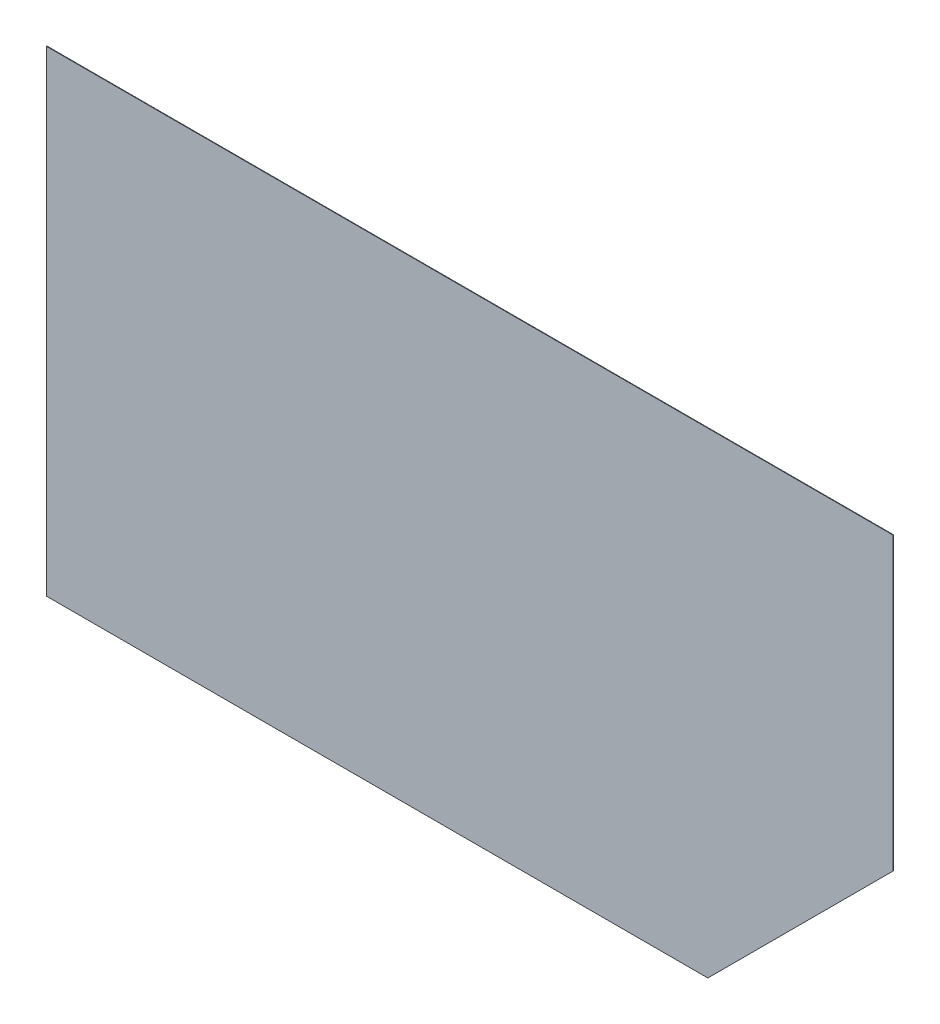
ISO-10303-21;
HEADER;
FILE_DESCRIPTION(('STEP AP214'),'2;1');
FILE_NAME('part.step','',(''),(''),'','','');
FILE_SCHEMA(('AUTOMOTIVE_DESIGN { 1 0 10303 214 1 1 1 1 }'));
ENDSEC;
DATA;
#1=APPLICATION_CONTEXT('core data for automotive mechanical design processes');
#2=APPLICATION_PROTOCOL_DEFINITION('international standard','automotive_design',2000,#1);
#3=PRODUCT_CONTEXT('',#1,'mechanical');
#4=PRODUCT('Part','Part','',(#3));
#5=PRODUCT_RELATED_PRODUCT_CATEGORY('part','',(#4));
#6=PRODUCT_DEFINITION_FORMATION('','',#4);
#7=PRODUCT_DEFINITION_CONTEXT('part definition',#1,'design');
#8=PRODUCT_DEFINITION('design','',#6,#7);
#9=PRODUCT_DEFINITION_SHAPE('','',#8);
#10=(LENGTH_UNIT() NAMED_UNIT(*) SI_UNIT(.MILLI.,.METRE.));
#11=(NAMED_UNIT(*) PLANE_ANGLE_UNIT() SI_UNIT($,.RADIAN.));
#12=(NAMED_UNIT(*) SI_UNIT($,.STERADIAN.) SOLID_ANGLE_UNIT());
#13=UNCERTAINTY_MEASURE_WITH_UNIT(LENGTH_MEASURE(1.E-05),#10,'distance_accuracy_value','');
#14=(GEOMETRIC_REPRESENTATION_CONTEXT(3) GLOBAL_UNCERTAINTY_ASSIGNED_CONTEXT((#13)) GLOBAL_UNIT_ASSIGNED_CONTEXT((#10,
#11,#12)) REPRESENTATION_CONTEXT('',''));
#15=CARTESIAN_POINT('',(0.,0.,0.));
#16=DIRECTION('',(0.,0.,1.));
#17=DIRECTION('',(1.,0.,0.));
#18=AXIS2_PLACEMENT_3D('',#15,#16,#17);
#19=CARTESIAN_POINT('',(23.947199091077,5.32096770212589,-9.89160507138269E-05));
#20=CARTESIAN_POINT('',(23.947199091077,5.32096770202098,0.00110108394928638));
#21=CARTESIAN_POINT('',(23.9471990781982,4.24096770212589,-9.90104672664831E-05));
#22=CARTESIAN_POINT('',(23.9471990781982,4.24096770202099,0.00110098953273373));
#23=(BOUNDED_SURFACE() B_SPLINE_SURFACE(1,1,((#19,#20),(#21,#22)),.UNSPECIFIED.,.F.,.F.,
.F.) B_SPLINE_SURFACE_WITH_KNOTS((2,2),(2,2),(-9.E-05,0.00099),(-1.10000000000015E-06,
1.00000000000061E-07),
.UNSPECIFIED.) GEOMETRIC_REPRESENTATION_ITEM() RATIONAL_B_SPLINE_SURFACE(((1.,1.),(1.,1.))) REPRESENTATION_ITEM('') SURFACE());
#24=CARTESIAN_POINT('',(23.9471990792714,4.33096770202973,0.00100099740077972));
#25=CARTESIAN_POINT('',(23.9471990900038,5.23096770202972,0.00100107608124027));
#26=(BOUNDED_CURVE() B_SPLINE_CURVE(1,(#24,#25),.UNSPECIFIED.,.F.,
.F.) B_SPLINE_CURVE_WITH_KNOTS((2,2),(0.,0.0009),
.UNSPECIFIED.) CURVE() GEOMETRIC_REPRESENTATION_ITEM() RATIONAL_B_SPLINE_CURVE((1.,1.)) REPRESENTATION_ITEM(''));
#27=CARTESIAN_POINT('',(23.9471990792714,4.33096770202973,0.00100099740077972));
#28=VERTEX_POINT('',#27);
#29=CARTESIAN_POINT('',(23.9471990900039,5.23096770202972,0.00100107608124031));
#30=VERTEX_POINT('',#29);
#31=EDGE_CURVE('E140',#28,#30,#26,.T.);
#32=CARTESIAN_POINT('',(23.9471990900039,5.23096770202972,0.00100107608124031));
#33=CARTESIAN_POINT('',(23.9471990900039,5.23096770211714,1.07608124017374E-06));
#34=(BOUNDED_CURVE() B_SPLINE_CURVE(1,(#32,#33),.UNSPECIFIED.,.F.,
.F.) B_SPLINE_CURVE_WITH_KNOTS((2,2),(0.,1.00000000000014E-06),
.UNSPECIFIED.) CURVE() GEOMETRIC_REPRESENTATION_ITEM() RATIONAL_B_SPLINE_CURVE((1.,1.)) REPRESENTATION_ITEM(''));
#35=CARTESIAN_POINT('',(23.9471990900039,5.23096770211715,1.07608124017347E-06));
#36=VERTEX_POINT('',#35);
#37=EDGE_CURVE('E11',#30,#36,#34,.T.);
#38=CARTESIAN_POINT('',(23.9471990792714,4.33096770211716,9.9740077958918E-07));
#39=CARTESIAN_POINT('',(23.9471990900038,5.23096770211715,1.076081240136E-06));
#40=(BOUNDED_CURVE() B_SPLINE_CURVE(1,(#38,#39),.UNSPECIFIED.,.F.,
.F.) B_SPLINE_CURVE_WITH_KNOTS((2,2),(0.,0.00089999999999999),
.UNSPECIFIED.) CURVE() GEOMETRIC_REPRESENTATION_ITEM() RATIONAL_B_SPLINE_CURVE((1.,1.)) REPRESENTATION_ITEM(''));
#41=CARTESIAN_POINT('',(23.9471990792714,4.33096770211716,9.9740077958918E-07));
#42=VERTEX_POINT('',#41);
#43=EDGE_CURVE('E93',#42,#36,#40,.T.);
#44=CARTESIAN_POINT('',(23.9471990792714,4.33096770202973,0.00100099740077972));
#45=CARTESIAN_POINT('',(23.9471990792714,4.33096770211715,9.97400779589451E-07));
#46=(BOUNDED_CURVE() B_SPLINE_CURVE(1,(#44,#45),.UNSPECIFIED.,.F.,
.F.) B_SPLINE_CURVE_WITH_KNOTS((2,2),(0.,1.00000000000013E-06),
.UNSPECIFIED.) CURVE() GEOMETRIC_REPRESENTATION_ITEM() RATIONAL_B_SPLINE_CURVE((1.,1.)) REPRESENTATION_ITEM(''));
#47=EDGE_CURVE('E147',#28,#42,#46,.T.);
#48=ORIENTED_EDGE('',*,*,#31,.T.);
#49=ORIENTED_EDGE('',*,*,#37,.T.);
#50=ORIENTED_EDGE('',*,*,#43,.F.);
#51=ORIENTED_EDGE('',*,*,#47,.F.);
#52=EDGE_LOOP('',(#48,#49,#50,#51));
#53=FACE_BOUND('',#52,.T.);
#54=ADVANCED_FACE('F17',(#53),#23,.T.);
#55=CARTESIAN_POINT('',(25.7071990900039,5.2309676811381,-9.89239187617483E-05));
#56=CARTESIAN_POINT('',(25.7071990900039,5.23096768103319,0.0011010760812385));
#57=CARTESIAN_POINT('',(23.7871990900039,5.23096770403387,-9.89239187597466E-05));
#58=CARTESIAN_POINT('',(23.7871990900039,5.23096770392896,0.0011010760812405));
#59=(BOUNDED_SURFACE() B_SPLINE_SURFACE(1,1,((#55,#56),(#57,#58)),.UNSPECIFIED.,.F.,.F.,
.F.) B_SPLINE_SURFACE_WITH_KNOTS((2,2),(2,2),(-0.00016,0.00176),(-1.10000000000023E-06,
1.00000000000021E-07),
.UNSPECIFIED.) GEOMETRIC_REPRESENTATION_ITEM() RATIONAL_B_SPLINE_SURFACE(((1.,1.),(1.,1.))) REPRESENTATION_ITEM('') SURFACE());
#60=CARTESIAN_POINT('',(23.9471990900039,5.23096770202972,0.00100107608124031));
#61=CARTESIAN_POINT('',(25.5471990900039,5.23096768294991,0.00100107608123864));
#62=(BOUNDED_CURVE() B_SPLINE_CURVE(1,(#60,#61),.UNSPECIFIED.,.F.,
.F.) B_SPLINE_CURVE_WITH_KNOTS((2,2),(0.,0.0016),
.UNSPECIFIED.) CURVE() GEOMETRIC_REPRESENTATION_ITEM() RATIONAL_B_SPLINE_CURVE((1.,1.)) REPRESENTATION_ITEM(''));
#63=CARTESIAN_POINT('',(25.5471990900039,5.23096768294992,0.00100107608123857));
#64=VERTEX_POINT('',#63);
#65=EDGE_CURVE('E111',#30,#64,#62,.T.);
#66=CARTESIAN_POINT('',(25.5471990900039,5.23096768294992,0.00100107608123857));
#67=CARTESIAN_POINT('',(25.5471990900039,5.23096768303734,1.07608123843902E-06));
#68=(BOUNDED_CURVE() B_SPLINE_CURVE(1,(#66,#67),.UNSPECIFIED.,.F.,
.F.) B_SPLINE_CURVE_WITH_KNOTS((2,2),(0.,1.00000000000013E-06),
.UNSPECIFIED.) CURVE() GEOMETRIC_REPRESENTATION_ITEM() RATIONAL_B_SPLINE_CURVE((1.,1.)) REPRESENTATION_ITEM(''));
#69=CARTESIAN_POINT('',(25.5471990900039,5.23096768303735,1.07608123843875E-06));
#70=VERTEX_POINT('',#69);
#71=EDGE_CURVE('E32',#64,#70,#68,.T.);
#72=CARTESIAN_POINT('',(23.9471990900039,5.23096770211715,1.07608124017347E-06));
#73=CARTESIAN_POINT('',(25.5471990900039,5.23096768303734,1.07608123850546E-06));
#74=(BOUNDED_CURVE() B_SPLINE_CURVE(1,(#72,#73),.UNSPECIFIED.,.F.,
.F.) B_SPLINE_CURVE_WITH_KNOTS((2,2),(0.,0.0016),
.UNSPECIFIED.) CURVE() GEOMETRIC_REPRESENTATION_ITEM() RATIONAL_B_SPLINE_CURVE((1.,1.)) REPRESENTATION_ITEM(''));
#75=EDGE_CURVE('E87',#36,#70,#74,.T.);
#76=ORIENTED_EDGE('',*,*,#65,.T.);
#77=ORIENTED_EDGE('',*,*,#71,.T.);
#78=ORIENTED_EDGE('',*,*,#75,.F.);
#79=ORIENTED_EDGE('',*,*,#37,.F.);
#80=EDGE_LOOP('',(#76,#77,#78,#79));
#81=FACE_BOUND('',#80,.T.);
#82=ADVANCED_FACE('F19',(#81),#59,.T.);
#83=CARTESIAN_POINT('',(25.5471990827893,4.6259676830461,-9.89768095156337E-05));
#84=CARTESIAN_POINT('',(25.5471990827894,4.62596768294119,0.00110102319048455));
#85=CARTESIAN_POINT('',(25.5471990906598,5.28596768304609,-9.89191105112327E-05));
#86=CARTESIAN_POINT('',(25.5471990906598,5.28596768294118,0.00110108088948895));
#87=(BOUNDED_SURFACE() B_SPLINE_SURFACE(1,1,((#83,#84),(#85,#86)),.UNSPECIFIED.,.F.,.F.,
.F.) B_SPLINE_SURFACE_WITH_KNOTS((2,2),(2,2),(-5.50000000000078E-05,0.000604999999999992),
(-1.10000000000017E-06,1.00000000000016E-07),
.UNSPECIFIED.) GEOMETRIC_REPRESENTATION_ITEM() RATIONAL_B_SPLINE_SURFACE(((1.,1.),(1.,1.))) REPRESENTATION_ITEM('') SURFACE());
#88=CARTESIAN_POINT('',(25.5471990900039,5.23096768294992,0.00100107608123857));
#89=CARTESIAN_POINT('',(25.5471990834452,4.68096768294993,0.0010010279987349));
#90=(BOUNDED_CURVE() B_SPLINE_CURVE(1,(#88,#89),.UNSPECIFIED.,.F.,
.F.) B_SPLINE_CURVE_WITH_KNOTS((2,2),(0.,0.000549999999999989),
.UNSPECIFIED.) CURVE() GEOMETRIC_REPRESENTATION_ITEM() RATIONAL_B_SPLINE_CURVE((1.,1.)) REPRESENTATION_ITEM(''));
#91=CARTESIAN_POINT('',(25.5471990834451,4.68096768294993,0.00100102799873488));
#92=VERTEX_POINT('',#91);
#93=EDGE_CURVE('E69',#64,#92,#90,.T.);
#94=CARTESIAN_POINT('',(25.5471990834451,4.68096768294993,0.00100102799873488));
#95=CARTESIAN_POINT('',(25.5471990834451,4.68096768303735,1.02799873474862E-06));
#96=(BOUNDED_CURVE() B_SPLINE_CURVE(1,(#94,#95),.UNSPECIFIED.,.F.,
.F.) B_SPLINE_CURVE_WITH_KNOTS((2,2),(0.,1.00000000000013E-06),
.UNSPECIFIED.) CURVE() GEOMETRIC_REPRESENTATION_ITEM() RATIONAL_B_SPLINE_CURVE((1.,1.)) REPRESENTATION_ITEM(''));
#97=CARTESIAN_POINT('',(25.5471990834451,4.68096768303736,1.02799873474835E-06));
#98=VERTEX_POINT('',#97);
#99=EDGE_CURVE('E62',#92,#98,#96,.T.);
#100=CARTESIAN_POINT('',(25.5471990900039,5.23096768303735,1.07608123843875E-06));
#101=CARTESIAN_POINT('',(25.5471990834452,4.68096768303736,1.02799873477125E-06));
#102=(BOUNDED_CURVE() B_SPLINE_CURVE(1,(#100,#101),.UNSPECIFIED.,.F.,
.F.) B_SPLINE_CURVE_WITH_KNOTS((2,2),(0.,0.00054999999999999),
.UNSPECIFIED.) CURVE() GEOMETRIC_REPRESENTATION_ITEM() RATIONAL_B_SPLINE_CURVE((1.,1.)) REPRESENTATION_ITEM(''));
#103=EDGE_CURVE('E66',#70,#98,#102,.T.);
#104=ORIENTED_EDGE('',*,*,#93,.T.);
#105=ORIENTED_EDGE('',*,*,#99,.T.);
#106=ORIENTED_EDGE('',*,*,#103,.F.);
#107=ORIENTED_EDGE('',*,*,#71,.F.);
#108=EDGE_LOOP('',(#104,#105,#106,#107));
#109=FACE_BOUND('',#108,.T.);
#110=ADVANCED_FACE('F64',(#109),#87,.T.);
#111=CARTESIAN_POINT('',(25.1621990788541,4.29596768763722,-9.90056590174358E-05));
#112=CARTESIAN_POINT('',(25.1621990788541,4.29596768753231,0.00110099434098279));
#113=CARTESIAN_POINT('',(25.5821990838625,4.71596768262872,-9.89689414696185E-05));
#114=CARTESIAN_POINT('',(25.5821990838625,4.71596768252382,0.0011010310585306));
#115=(BOUNDED_SURFACE() B_SPLINE_SURFACE(1,1,((#111,#112),(#113,#114)),.UNSPECIFIED.,.F.,.F.,
.F.) B_SPLINE_SURFACE_WITH_KNOTS((2,2),(2,2),(-4.94974746830586E-05,0.000544472221513578),
(-1.10000000000015E-06,1.00000000000073E-07),
.UNSPECIFIED.) GEOMETRIC_REPRESENTATION_ITEM() RATIONAL_B_SPLINE_SURFACE(((1.,1.),(1.,1.))) REPRESENTATION_ITEM('') SURFACE());
#116=CARTESIAN_POINT('',(25.5471990834451,4.68096768294993,0.00100102799873488));
#117=CARTESIAN_POINT('',(25.1971990792714,4.33096768712368,0.00100099740077837));
#118=(BOUNDED_CURVE() B_SPLINE_CURVE(1,(#116,#117),.UNSPECIFIED.,.F.,
.F.) B_SPLINE_CURVE_WITH_KNOTS((2,2),(0.,0.000494974746830524),
.UNSPECIFIED.) CURVE() GEOMETRIC_REPRESENTATION_ITEM() RATIONAL_B_SPLINE_CURVE((1.,1.)) REPRESENTATION_ITEM(''));
#119=CARTESIAN_POINT('',(25.1971990792715,4.33096768712362,0.00100099740077842));
#120=VERTEX_POINT('',#119);
#121=EDGE_CURVE('E112',#92,#120,#118,.T.);
#122=CARTESIAN_POINT('',(25.1971990792715,4.33096768712362,0.00100099740077842));
#123=CARTESIAN_POINT('',(25.1971990792715,4.33096768721104,9.97400778288544E-07));
#124=(BOUNDED_CURVE() B_SPLINE_CURVE(1,(#122,#123),.UNSPECIFIED.,.F.,
.F.) B_SPLINE_CURVE_WITH_KNOTS((2,2),(0.,1.00000000000013E-06),
.UNSPECIFIED.) CURVE() GEOMETRIC_REPRESENTATION_ITEM() RATIONAL_B_SPLINE_CURVE((1.,1.)) REPRESENTATION_ITEM(''));
#125=CARTESIAN_POINT('',(25.1971990792715,4.33096768721105,9.97400778288138E-07));
#126=VERTEX_POINT('',#125);
#127=EDGE_CURVE('E74',#120,#126,#124,.T.);
#128=CARTESIAN_POINT('',(25.5471990834451,4.68096768303736,1.02799873474835E-06));
#129=CARTESIAN_POINT('',(25.1971990792714,4.33096768721111,9.97400778233912E-07));
#130=(BOUNDED_CURVE() B_SPLINE_CURVE(1,(#128,#129),.UNSPECIFIED.,.F.,
.F.) B_SPLINE_CURVE_WITH_KNOTS((2,2),(0.,0.000494974746830524),
.UNSPECIFIED.) CURVE() GEOMETRIC_REPRESENTATION_ITEM() RATIONAL_B_SPLINE_CURVE((1.,1.)) REPRESENTATION_ITEM(''));
#131=EDGE_CURVE('E77',#98,#126,#130,.T.);
#132=ORIENTED_EDGE('',*,*,#121,.T.);
#133=ORIENTED_EDGE('',*,*,#127,.T.);
#134=ORIENTED_EDGE('',*,*,#131,.F.);
#135=ORIENTED_EDGE('',*,*,#99,.F.);
#136=EDGE_LOOP('',(#132,#133,#134,#135));
#137=FACE_BOUND('',#136,.T.);
#138=ADVANCED_FACE('F78',(#137),#115,.T.);
#139=CARTESIAN_POINT('',(23.8221990792714,4.3309677036165,-9.90025992202934E-05));
#140=CARTESIAN_POINT('',(23.8221990792714,4.33096770351159,0.00110099740077987));
#141=CARTESIAN_POINT('',(25.3221990792715,4.33096768572918,-9.90025992218573E-05));
#142=CARTESIAN_POINT('',(25.3221990792715,4.33096768562427,0.0011009974007783));
#143=(BOUNDED_SURFACE() B_SPLINE_SURFACE(1,1,((#139,#140),(#141,#142)),.UNSPECIFIED.,.F.,.F.,
.F.) B_SPLINE_SURFACE_WITH_KNOTS((2,2),(2,2),(-0.00012500000000001,0.00137500000000011),
(-1.10000000000015E-06,1.00000000000014E-07),
.UNSPECIFIED.) GEOMETRIC_REPRESENTATION_ITEM() RATIONAL_B_SPLINE_SURFACE(((1.,1.),(1.,1.))) REPRESENTATION_ITEM('') SURFACE());
#144=CARTESIAN_POINT('',(25.1971990792715,4.33096768712362,0.00100099740077842));
#145=CARTESIAN_POINT('',(23.9471990792714,4.33096770202972,0.00100099740077972));
#146=(BOUNDED_CURVE() B_SPLINE_CURVE(1,(#144,#145),.UNSPECIFIED.,.F.,
.F.) B_SPLINE_CURVE_WITH_KNOTS((2,2),(0.,0.0012500000000001),
.UNSPECIFIED.) CURVE() GEOMETRIC_REPRESENTATION_ITEM() RATIONAL_B_SPLINE_CURVE((1.,1.)) REPRESENTATION_ITEM(''));
#147=EDGE_CURVE('E124',#120,#28,#146,.T.);
#148=CARTESIAN_POINT('',(25.1971990792715,4.33096768721105,9.97400778288138E-07));
#149=CARTESIAN_POINT('',(23.9471990792714,4.33096770211715,9.9740077959127E-07));
#150=(BOUNDED_CURVE() B_SPLINE_CURVE(1,(#148,#149),.UNSPECIFIED.,.F.,
.F.) B_SPLINE_CURVE_WITH_KNOTS((2,2),(0.,0.0012500000000001),
.UNSPECIFIED.) CURVE() GEOMETRIC_REPRESENTATION_ITEM() RATIONAL_B_SPLINE_CURVE((1.,1.)) REPRESENTATION_ITEM(''));
#151=EDGE_CURVE('E23',#126,#42,#150,.T.);
#152=ORIENTED_EDGE('',*,*,#147,.T.);
#153=ORIENTED_EDGE('',*,*,#47,.T.);
#154=ORIENTED_EDGE('',*,*,#151,.F.);
#155=ORIENTED_EDGE('',*,*,#127,.F.);
#156=EDGE_LOOP('',(#152,#153,#154,#155));
#157=FACE_BOUND('',#156,.T.);
#158=ADVANCED_FACE('F283',(#157),#143,.T.);
#159=CARTESIAN_POINT('',(23.787199091077,5.32096770393771,0.00100108394928649));
#160=CARTESIAN_POINT('',(25.7071990910772,5.32096768104194,0.00100108394928449));
#161=CARTESIAN_POINT('',(23.7871990781981,4.2409677039377,0.00100098953273383));
#162=CARTESIAN_POINT('',(25.7071990781983,4.24096768104193,0.00100098953273183));
#163=(BOUNDED_SURFACE() B_SPLINE_SURFACE(1,1,((#159,#160),(#161,#162)),.UNSPECIFIED.,.F.,.F.,
.F.) B_SPLINE_SURFACE_WITH_KNOTS((2,2),(2,2),(-0.00099,9.00000000000106E-05),
(-0.000160000000000011,0.00176000000000012),
.UNSPECIFIED.) GEOMETRIC_REPRESENTATION_ITEM() RATIONAL_B_SPLINE_SURFACE(((1.,1.),(1.,1.))) REPRESENTATION_ITEM('') SURFACE());
#164=ORIENTED_EDGE('',*,*,#147,.F.);
#165=ORIENTED_EDGE('',*,*,#121,.F.);
#166=ORIENTED_EDGE('',*,*,#93,.F.);
#167=ORIENTED_EDGE('',*,*,#65,.F.);
#168=ORIENTED_EDGE('',*,*,#31,.F.);
#169=EDGE_LOOP('',(#164,#165,#166,#167,#168));
#170=FACE_BOUND('',#169,.T.);
#171=ADVANCED_FACE('F311',(#170),#163,.T.);
#172=CARTESIAN_POINT('',(23.7871990781981,4.24096770402513,9.89532733701298E-07));
#173=CARTESIAN_POINT('',(25.7071990781983,4.24096768112936,9.89532731699687E-07));
#174=CARTESIAN_POINT('',(23.787199091077,5.32096770402514,1.08394928635748E-06));
#175=CARTESIAN_POINT('',(25.7071990910772,5.32096768112937,1.08394928435587E-06));
#176=(BOUNDED_SURFACE() B_SPLINE_SURFACE(1,1,((#172,#173),(#174,#175)),.UNSPECIFIED.,.F.,.F.,
.F.) B_SPLINE_SURFACE_WITH_KNOTS((2,2),(2,2),(-0.00099,9.000000000001E-05),
(-0.000160000000000011,0.00176000000000012),
.UNSPECIFIED.) GEOMETRIC_REPRESENTATION_ITEM() RATIONAL_B_SPLINE_SURFACE(((1.,1.),(1.,1.))) REPRESENTATION_ITEM('') SURFACE());
#177=ORIENTED_EDGE('',*,*,#43,.T.);
#178=ORIENTED_EDGE('',*,*,#75,.T.);
#179=ORIENTED_EDGE('',*,*,#103,.T.);
#180=ORIENTED_EDGE('',*,*,#131,.T.);
#181=ORIENTED_EDGE('',*,*,#151,.T.);
#182=EDGE_LOOP('',(#177,#178,#179,#180,#181));
#183=FACE_BOUND('',#182,.T.);
#184=ADVANCED_FACE('F86',(#183),#176,.T.);
#185=CLOSED_SHELL('',(#54,#82,#110,#138,#158,#171,#184));
#186=MANIFOLD_SOLID_BREP('B1',#185);
#187=ADVANCED_BREP_SHAPE_REPRESENTATION('',(#18,#186),#14);
#188=SHAPE_DEFINITION_REPRESENTATION(#9,#187);
ENDSEC;
END-ISO-10303-21;
